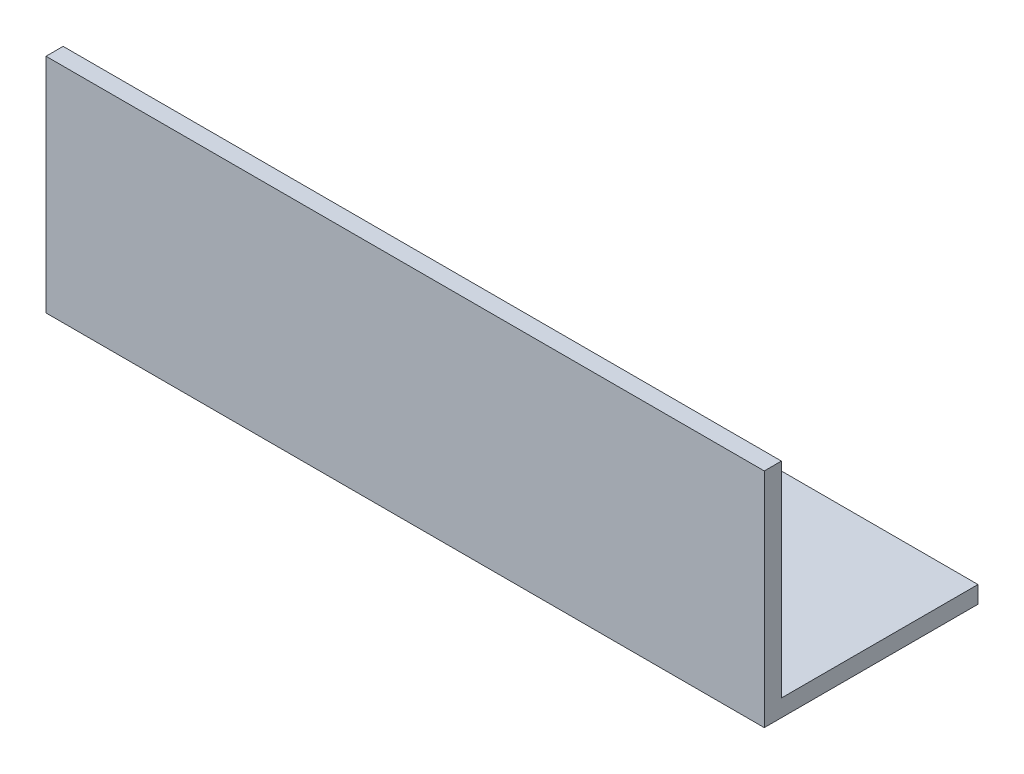
ISO-10303-21;
HEADER;
FILE_DESCRIPTION(('STEP AP214'),'2;1');
FILE_NAME('part.step','',(''),(''),'','','');
FILE_SCHEMA(('AUTOMOTIVE_DESIGN { 1 0 10303 214 1 1 1 1 }'));
ENDSEC;
DATA;
#1=APPLICATION_CONTEXT('core data for automotive mechanical design processes');
#2=APPLICATION_PROTOCOL_DEFINITION('international standard','automotive_design',2000,#1);
#3=PRODUCT_CONTEXT('',#1,'mechanical');
#4=PRODUCT('Part','Part','',(#3));
#5=PRODUCT_RELATED_PRODUCT_CATEGORY('part','',(#4));
#6=PRODUCT_DEFINITION_FORMATION('','',#4);
#7=PRODUCT_DEFINITION_CONTEXT('part definition',#1,'design');
#8=PRODUCT_DEFINITION('design','',#6,#7);
#9=PRODUCT_DEFINITION_SHAPE('','',#8);
#10=(LENGTH_UNIT() NAMED_UNIT(*) SI_UNIT(.MILLI.,.METRE.));
#11=(NAMED_UNIT(*) PLANE_ANGLE_UNIT() SI_UNIT($,.RADIAN.));
#12=(NAMED_UNIT(*) SI_UNIT($,.STERADIAN.) SOLID_ANGLE_UNIT());
#13=UNCERTAINTY_MEASURE_WITH_UNIT(LENGTH_MEASURE(1.E-05),#10,'distance_accuracy_value','');
#14=(GEOMETRIC_REPRESENTATION_CONTEXT(3) GLOBAL_UNCERTAINTY_ASSIGNED_CONTEXT((#13)) GLOBAL_UNIT_ASSIGNED_CONTEXT((#10,
#11,#12)) REPRESENTATION_CONTEXT('',''));
#15=CARTESIAN_POINT('',(0.,0.,0.));
#16=DIRECTION('',(0.,0.,1.));
#17=DIRECTION('',(1.,0.,0.));
#18=AXIS2_PLACEMENT_3D('',#15,#16,#17);
#19=CARTESIAN_POINT('',(0.,20.64,-0.800000000000001));
#20=DIRECTION('',(0.,0.,-1.));
#21=DIRECTION('',(-1.,0.,0.));
#22=AXIS2_PLACEMENT_3D('',#19,#20,#21);
#23=PLANE('',#22);
#24=DIRECTION('',(1.,0.,0.));
#25=VECTOR('',#24,1.);
#26=CARTESIAN_POINT('',(0.,1.59,-0.800000000000001));
#27=LINE('',#26,#25);
#28=CARTESIAN_POINT('',(-33.34,1.59,-0.800000000000002));
#29=VERTEX_POINT('',#28);
#30=CARTESIAN_POINT('',(33.34,1.59,-0.800000000000002));
#31=VERTEX_POINT('',#30);
#32=EDGE_CURVE('E201',#29,#31,#27,.T.);
#33=ORIENTED_EDGE('',*,*,#32,.F.);
#34=DIRECTION('',(0.,-1.,0.));
#35=VECTOR('',#34,1.);
#36=CARTESIAN_POINT('',(-33.34,20.64,-0.800000000000001));
#37=LINE('',#36,#35);
#38=CARTESIAN_POINT('',(-33.34,20.64,-0.800000000000001));
#39=VERTEX_POINT('',#38);
#40=EDGE_CURVE('E180',#39,#29,#37,.T.);
#41=ORIENTED_EDGE('',*,*,#40,.F.);
#42=DIRECTION('',(1.,0.,0.));
#43=VECTOR('',#42,1.);
#44=CARTESIAN_POINT('',(0.,20.64,-0.800000000000001));
#45=LINE('',#44,#43);
#46=CARTESIAN_POINT('',(33.34,20.64,-0.800000000000001));
#47=VERTEX_POINT('',#46);
#48=EDGE_CURVE('E12',#39,#47,#45,.T.);
#49=ORIENTED_EDGE('',*,*,#48,.T.);
#50=DIRECTION('',(0.,-1.,0.));
#51=VECTOR('',#50,1.);
#52=CARTESIAN_POINT('',(33.34,20.64,-0.800000000000001));
#53=LINE('',#52,#51);
#54=EDGE_CURVE('E178',#47,#31,#53,.T.);
#55=ORIENTED_EDGE('',*,*,#54,.T.);
#56=EDGE_LOOP('',(#33,#41,#49,#55));
#57=FACE_BOUND('',#56,.T.);
#58=ADVANCED_FACE('F143',(#57),#23,.T.);
#59=CARTESIAN_POINT('',(0.,20.64,0.));
#60=DIRECTION('',(0.,1.,0.));
#61=DIRECTION('',(0.,0.,1.));
#62=AXIS2_PLACEMENT_3D('',#59,#60,#61);
#63=PLANE('',#62);
#64=ORIENTED_EDGE('',*,*,#48,.F.);
#65=DIRECTION('',(0.,0.,-1.));
#66=VECTOR('',#65,1.);
#67=CARTESIAN_POINT('',(-33.34,20.64,0.79));
#68=LINE('',#67,#66);
#69=CARTESIAN_POINT('',(-33.34,20.64,0.79));
#70=VERTEX_POINT('',#69);
#71=EDGE_CURVE('E206',#70,#39,#68,.T.);
#72=ORIENTED_EDGE('',*,*,#71,.F.);
#73=DIRECTION('',(1.,0.,0.));
#74=VECTOR('',#73,1.);
#75=CARTESIAN_POINT('',(0.,20.64,0.789999999999999));
#76=LINE('',#75,#74);
#77=CARTESIAN_POINT('',(33.34,20.64,0.789999999999999));
#78=VERTEX_POINT('',#77);
#79=EDGE_CURVE('E154',#70,#78,#76,.T.);
#80=ORIENTED_EDGE('',*,*,#79,.T.);
#81=DIRECTION('',(0.,0.,-1.));
#82=VECTOR('',#81,1.);
#83=CARTESIAN_POINT('',(33.34,20.64,0.789999999999999));
#84=LINE('',#83,#82);
#85=EDGE_CURVE('E183',#78,#47,#84,.T.);
#86=ORIENTED_EDGE('',*,*,#85,.T.);
#87=EDGE_LOOP('',(#64,#72,#80,#86));
#88=FACE_BOUND('',#87,.T.);
#89=ADVANCED_FACE('F184',(#88),#63,.T.);
#90=CARTESIAN_POINT('',(0.,0.,0.));
#91=DIRECTION('',(0.,1.,0.));
#92=DIRECTION('',(0.,0.,1.));
#93=AXIS2_PLACEMENT_3D('',#90,#91,#92);
#94=PLANE('',#93);
#95=DIRECTION('',(1.,0.,0.));
#96=VECTOR('',#95,1.);
#97=CARTESIAN_POINT('',(0.,0.,0.789999999999999));
#98=LINE('',#97,#96);
#99=CARTESIAN_POINT('',(-33.34,0.,0.79));
#100=VERTEX_POINT('',#99);
#101=CARTESIAN_POINT('',(33.34,0.,0.789999999999999));
#102=VERTEX_POINT('',#101);
#103=EDGE_CURVE('E209',#100,#102,#98,.T.);
#104=ORIENTED_EDGE('',*,*,#103,.F.);
#105=DIRECTION('',(0.,0.,-1.));
#106=VECTOR('',#105,1.);
#107=CARTESIAN_POINT('',(-33.34,0.,0.79));
#108=LINE('',#107,#106);
#109=CARTESIAN_POINT('',(-33.34,0.,-19.05));
#110=VERTEX_POINT('',#109);
#111=EDGE_CURVE('E197',#100,#110,#108,.T.);
#112=ORIENTED_EDGE('',*,*,#111,.T.);
#113=DIRECTION('',(1.,0.,0.));
#114=VECTOR('',#113,1.);
#115=CARTESIAN_POINT('',(0.,0.,-19.05));
#116=LINE('',#115,#114);
#117=CARTESIAN_POINT('',(33.34,0.,-19.05));
#118=VERTEX_POINT('',#117);
#119=EDGE_CURVE('E235',#110,#118,#116,.T.);
#120=ORIENTED_EDGE('',*,*,#119,.T.);
#121=DIRECTION('',(0.,0.,-1.));
#122=VECTOR('',#121,1.);
#123=CARTESIAN_POINT('',(33.34,0.,0.789999999999999));
#124=LINE('',#123,#122);
#125=EDGE_CURVE('E189',#102,#118,#124,.T.);
#126=ORIENTED_EDGE('',*,*,#125,.F.);
#127=EDGE_LOOP('',(#104,#112,#120,#126));
#128=FACE_BOUND('',#127,.T.);
#129=CARTESIAN_POINT('',(13.825,0.,-10.08));
#130=DIRECTION('',(0.,1.,0.));
#131=DIRECTION('',(0.,0.,1.));
#132=AXIS2_PLACEMENT_3D('',#129,#130,#131);
#133=CIRCLE('',#132,3.175);
#134=CARTESIAN_POINT('',(13.825,0.,-13.255));
#135=VERTEX_POINT('',#134);
#136=EDGE_CURVE('E244',#135,#135,#133,.T.);
#137=ORIENTED_EDGE('',*,*,#136,.T.);
#138=EDGE_LOOP('',(#137));
#139=FACE_BOUND('',#138,.T.);
#140=CARTESIAN_POINT('',(-13.825,0.,-10.08));
#141=DIRECTION('',(0.,1.,0.));
#142=DIRECTION('',(0.,0.,1.));
#143=AXIS2_PLACEMENT_3D('',#140,#141,#142);
#144=CIRCLE('',#143,3.175);
#145=CARTESIAN_POINT('',(-13.825,0.,-13.255));
#146=VERTEX_POINT('',#145);
#147=EDGE_CURVE('E239',#146,#146,#144,.T.);
#148=ORIENTED_EDGE('',*,*,#147,.T.);
#149=EDGE_LOOP('',(#148));
#150=FACE_BOUND('',#149,.T.);
#151=ADVANCED_FACE('F285',(#128,#139,#150),#94,.F.);
#152=CARTESIAN_POINT('',(0.,20.64,0.789999999999999));
#153=DIRECTION('',(0.,0.,-1.));
#154=DIRECTION('',(-1.,0.,0.));
#155=AXIS2_PLACEMENT_3D('',#152,#153,#154);
#156=PLANE('',#155);
#157=DIRECTION('',(0.,-1.,0.));
#158=VECTOR('',#157,1.);
#159=CARTESIAN_POINT('',(-33.34,20.64,0.79));
#160=LINE('',#159,#158);
#161=EDGE_CURVE('E203',#70,#100,#160,.T.);
#162=ORIENTED_EDGE('',*,*,#161,.T.);
#163=ORIENTED_EDGE('',*,*,#103,.T.);
#164=DIRECTION('',(0.,-1.,0.));
#165=VECTOR('',#164,1.);
#166=CARTESIAN_POINT('',(33.34,20.64,0.789999999999999));
#167=LINE('',#166,#165);
#168=EDGE_CURVE('E147',#78,#102,#167,.T.);
#169=ORIENTED_EDGE('',*,*,#168,.F.);
#170=ORIENTED_EDGE('',*,*,#79,.F.);
#171=EDGE_LOOP('',(#162,#163,#169,#170));
#172=FACE_BOUND('',#171,.T.);
#173=ADVANCED_FACE('F283',(#172),#156,.F.);
#174=CARTESIAN_POINT('',(33.34,20.64,0.789999999999999));
#175=DIRECTION('',(-1.,0.,0.));
#176=DIRECTION('',(0.,0.,1.));
#177=AXIS2_PLACEMENT_3D('',#174,#175,#176);
#178=PLANE('',#177);
#179=ORIENTED_EDGE('',*,*,#168,.T.);
#180=ORIENTED_EDGE('',*,*,#125,.T.);
#181=DIRECTION('',(0.,-1.,0.));
#182=VECTOR('',#181,1.);
#183=CARTESIAN_POINT('',(33.34,1.59,-19.05));
#184=LINE('',#183,#182);
#185=CARTESIAN_POINT('',(33.34,1.59,-19.05));
#186=VERTEX_POINT('',#185);
#187=EDGE_CURVE('E224',#186,#118,#184,.T.);
#188=ORIENTED_EDGE('',*,*,#187,.F.);
#189=DIRECTION('',(0.,0.,1.));
#190=VECTOR('',#189,1.);
#191=CARTESIAN_POINT('',(33.34,1.59,-19.05));
#192=LINE('',#191,#190);
#193=EDGE_CURVE('E194',#186,#31,#192,.T.);
#194=ORIENTED_EDGE('',*,*,#193,.T.);
#195=ORIENTED_EDGE('',*,*,#54,.F.);
#196=ORIENTED_EDGE('',*,*,#85,.F.);
#197=EDGE_LOOP('',(#179,#180,#188,#194,#195,#196));
#198=FACE_BOUND('',#197,.T.);
#199=ADVANCED_FACE('F145',(#198),#178,.F.);
#200=CARTESIAN_POINT('',(-33.34,20.64,0.79));
#201=DIRECTION('',(-1.,0.,0.));
#202=DIRECTION('',(0.,0.,1.));
#203=AXIS2_PLACEMENT_3D('',#200,#201,#202);
#204=PLANE('',#203);
#205=ORIENTED_EDGE('',*,*,#40,.T.);
#206=DIRECTION('',(0.,0.,1.));
#207=VECTOR('',#206,1.);
#208=CARTESIAN_POINT('',(-33.34,1.59,-19.05));
#209=LINE('',#208,#207);
#210=CARTESIAN_POINT('',(-33.34,1.59,-19.05));
#211=VERTEX_POINT('',#210);
#212=EDGE_CURVE('E228',#211,#29,#209,.T.);
#213=ORIENTED_EDGE('',*,*,#212,.F.);
#214=DIRECTION('',(0.,-1.,0.));
#215=VECTOR('',#214,1.);
#216=CARTESIAN_POINT('',(-33.34,1.59,-19.05));
#217=LINE('',#216,#215);
#218=EDGE_CURVE('E231',#211,#110,#217,.T.);
#219=ORIENTED_EDGE('',*,*,#218,.T.);
#220=ORIENTED_EDGE('',*,*,#111,.F.);
#221=ORIENTED_EDGE('',*,*,#161,.F.);
#222=ORIENTED_EDGE('',*,*,#71,.T.);
#223=EDGE_LOOP('',(#205,#213,#219,#220,#221,#222));
#224=FACE_BOUND('',#223,.T.);
#225=ADVANCED_FACE('F278',(#224),#204,.T.);
#226=CARTESIAN_POINT('',(-13.825,1.59,-10.08));
#227=DIRECTION('',(0.,-1.,0.));
#228=DIRECTION('',(0.,0.,-1.));
#229=AXIS2_PLACEMENT_3D('',#226,#227,#228);
#230=CYLINDRICAL_SURFACE('',#229,3.175);
#231=CARTESIAN_POINT('',(-13.825,1.59,-10.08));
#232=DIRECTION('',(0.,1.,0.));
#233=DIRECTION('',(0.,0.,1.));
#234=AXIS2_PLACEMENT_3D('',#231,#232,#233);
#235=CIRCLE('',#234,3.175);
#236=CARTESIAN_POINT('',(-13.825,1.59,-13.255));
#237=VERTEX_POINT('',#236);
#238=EDGE_CURVE('E223',#237,#237,#235,.T.);
#239=CARTESIAN_POINT('',(-13.825,1.59,-13.255));
#240=CARTESIAN_POINT('',(-13.825,1.5734375,-13.255));
#241=CARTESIAN_POINT('',(-13.825,1.556875,-13.255));
#242=CARTESIAN_POINT('',(-13.825,1.52375,-13.255));
#243=CARTESIAN_POINT('',(-13.825,1.5071875,-13.255));
#244=CARTESIAN_POINT('',(-13.825,1.4740625,-13.255));
#245=CARTESIAN_POINT('',(-13.825,1.4575,-13.255));
#246=CARTESIAN_POINT('',(-13.825,1.424375,-13.255));
#247=CARTESIAN_POINT('',(-13.825,1.4078125,-13.255));
#248=CARTESIAN_POINT('',(-13.825,1.3746875,-13.255));
#249=CARTESIAN_POINT('',(-13.825,1.358125,-13.255));
#250=CARTESIAN_POINT('',(-13.825,1.325,-13.255));
#251=CARTESIAN_POINT('',(-13.825,1.3084375,-13.255));
#252=CARTESIAN_POINT('',(-13.825,1.2753125,-13.255));
#253=CARTESIAN_POINT('',(-13.825,1.25875,-13.255));
#254=CARTESIAN_POINT('',(-13.825,1.225625,-13.255));
#255=CARTESIAN_POINT('',(-13.825,1.2090625,-13.255));
#256=CARTESIAN_POINT('',(-13.825,1.1759375,-13.255));
#257=CARTESIAN_POINT('',(-13.825,1.159375,-13.255));
#258=CARTESIAN_POINT('',(-13.825,1.12625,-13.255));
#259=CARTESIAN_POINT('',(-13.825,1.1096875,-13.255));
#260=CARTESIAN_POINT('',(-13.825,1.0765625,-13.255));
#261=CARTESIAN_POINT('',(-13.825,1.06,-13.255));
#262=CARTESIAN_POINT('',(-13.825,1.026875,-13.255));
#263=CARTESIAN_POINT('',(-13.825,1.0103125,-13.255));
#264=CARTESIAN_POINT('',(-13.825,0.9771875,-13.255));
#265=CARTESIAN_POINT('',(-13.825,0.960625,-13.255));
#266=CARTESIAN_POINT('',(-13.825,0.9275,-13.255));
#267=CARTESIAN_POINT('',(-13.825,0.9109375,-13.255));
#268=CARTESIAN_POINT('',(-13.825,0.8778125,-13.255));
#269=CARTESIAN_POINT('',(-13.825,0.86125,-13.255));
#270=CARTESIAN_POINT('',(-13.825,0.828125,-13.255));
#271=CARTESIAN_POINT('',(-13.825,0.8115625,-13.255));
#272=CARTESIAN_POINT('',(-13.825,0.7784375,-13.255));
#273=CARTESIAN_POINT('',(-13.825,0.761875,-13.255));
#274=CARTESIAN_POINT('',(-13.825,0.72875,-13.255));
#275=CARTESIAN_POINT('',(-13.825,0.7121875,-13.255));
#276=CARTESIAN_POINT('',(-13.825,0.6790625,-13.255));
#277=CARTESIAN_POINT('',(-13.825,0.6625,-13.255));
#278=CARTESIAN_POINT('',(-13.825,0.629375,-13.255));
#279=CARTESIAN_POINT('',(-13.825,0.6128125,-13.255));
#280=CARTESIAN_POINT('',(-13.825,0.5796875,-13.255));
#281=CARTESIAN_POINT('',(-13.825,0.563125,-13.255));
#282=CARTESIAN_POINT('',(-13.825,0.53,-13.255));
#283=CARTESIAN_POINT('',(-13.825,0.5134375,-13.255));
#284=CARTESIAN_POINT('',(-13.825,0.4803125,-13.255));
#285=CARTESIAN_POINT('',(-13.825,0.46375,-13.255));
#286=CARTESIAN_POINT('',(-13.825,0.430625,-13.255));
#287=CARTESIAN_POINT('',(-13.825,0.4140625,-13.255));
#288=CARTESIAN_POINT('',(-13.825,0.3809375,-13.255));
#289=CARTESIAN_POINT('',(-13.825,0.364375,-13.255));
#290=CARTESIAN_POINT('',(-13.825,0.33125,-13.255));
#291=CARTESIAN_POINT('',(-13.825,0.3146875,-13.255));
#292=CARTESIAN_POINT('',(-13.825,0.2815625,-13.255));
#293=CARTESIAN_POINT('',(-13.825,0.265,-13.255));
#294=CARTESIAN_POINT('',(-13.825,0.231875,-13.255));
#295=CARTESIAN_POINT('',(-13.825,0.2153125,-13.255));
#296=CARTESIAN_POINT('',(-13.825,0.1821875,-13.255));
#297=CARTESIAN_POINT('',(-13.825,0.165625,-13.255));
#298=CARTESIAN_POINT('',(-13.825,0.1325,-13.255));
#299=CARTESIAN_POINT('',(-13.825,0.1159375,-13.255));
#300=CARTESIAN_POINT('',(-13.825,0.0828125000000001,-13.255));
#301=CARTESIAN_POINT('',(-13.825,0.06625,-13.255));
#302=CARTESIAN_POINT('',(-13.825,0.033125,-13.255));
#303=CARTESIAN_POINT('',(-13.825,0.0165625,-13.255));
#304=CARTESIAN_POINT('',(-13.825,0.,-13.255));
#305=B_SPLINE_CURVE_WITH_KNOTS('',3,(#239,#240,#241,#242,#243,#244,#245,#246,#247,#248,#249,
#250,#251,#252,#253,#254,#255,#256,#257,#258,#259,#260,#261,#262,#263,#264,#265,#266,#267,#268,
#269,#270,#271,#272,#273,#274,#275,#276,#277,#278,#279,#280,#281,#282,#283,#284,#285,#286,#287,
#288,#289,#290,#291,#292,#293,#294,#295,#296,#297,#298,#299,#300,#301,#302,#303,#304),
.UNSPECIFIED.,.F.,.F.,(4,2,2,2,2,2,2,2,2,2,2,2,2,2,2,2,2,2,2,2,2,2,2,2,2,2,2,2,2,2,2,2,4),(0.,
0.0496874999999998,0.0993749999999999,0.1490625,0.19875,0.2484375,0.298125,0.3478125,0.3975,
0.4471875,0.496875,0.5465625,0.59625,0.6459375,0.695625,0.7453125,0.795,0.8446875,0.894375,
0.9440625,0.99375,1.0434375,1.093125,1.1428125,1.1925,1.2421875,1.291875,1.3415625,1.39125,
1.4409375,1.490625,1.5403125,1.59),.UNSPECIFIED.);
#306=EDGE_CURVE('BSEAM296',#237,#146,#305,.T.);
#307=ORIENTED_EDGE('',*,*,#238,.T.);
#308=ORIENTED_EDGE('',*,*,#147,.F.);
#309=ORIENTED_EDGE('',*,*,#306,.T.);
#310=ORIENTED_EDGE('',*,*,#306,.F.);
#311=EDGE_LOOP('',(#307,#309,#308,#310));
#312=FACE_BOUND('',#311,.T.);
#313=ADVANCED_FACE('F296',(#312),#230,.F.);
#314=CARTESIAN_POINT('',(13.825,1.59,-10.08));
#315=DIRECTION('',(0.,-1.,0.));
#316=DIRECTION('',(0.,0.,-1.));
#317=AXIS2_PLACEMENT_3D('',#314,#315,#316);
#318=CYLINDRICAL_SURFACE('',#317,3.175);
#319=CARTESIAN_POINT('',(13.825,1.59,-10.08));
#320=DIRECTION('',(0.,1.,0.));
#321=DIRECTION('',(0.,0.,1.));
#322=AXIS2_PLACEMENT_3D('',#319,#320,#321);
#323=CIRCLE('',#322,3.175);
#324=CARTESIAN_POINT('',(13.825,1.59,-13.255));
#325=VERTEX_POINT('',#324);
#326=EDGE_CURVE('E254',#325,#325,#323,.T.);
#327=CARTESIAN_POINT('',(13.825,1.59,-13.255));
#328=CARTESIAN_POINT('',(13.825,1.5734375,-13.255));
#329=CARTESIAN_POINT('',(13.825,1.556875,-13.255));
#330=CARTESIAN_POINT('',(13.825,1.52375,-13.255));
#331=CARTESIAN_POINT('',(13.825,1.5071875,-13.255));
#332=CARTESIAN_POINT('',(13.825,1.4740625,-13.255));
#333=CARTESIAN_POINT('',(13.825,1.4575,-13.255));
#334=CARTESIAN_POINT('',(13.825,1.424375,-13.255));
#335=CARTESIAN_POINT('',(13.825,1.4078125,-13.255));
#336=CARTESIAN_POINT('',(13.825,1.3746875,-13.255));
#337=CARTESIAN_POINT('',(13.825,1.358125,-13.255));
#338=CARTESIAN_POINT('',(13.825,1.325,-13.255));
#339=CARTESIAN_POINT('',(13.825,1.3084375,-13.255));
#340=CARTESIAN_POINT('',(13.825,1.2753125,-13.255));
#341=CARTESIAN_POINT('',(13.825,1.25875,-13.255));
#342=CARTESIAN_POINT('',(13.825,1.225625,-13.255));
#343=CARTESIAN_POINT('',(13.825,1.2090625,-13.255));
#344=CARTESIAN_POINT('',(13.825,1.1759375,-13.255));
#345=CARTESIAN_POINT('',(13.825,1.159375,-13.255));
#346=CARTESIAN_POINT('',(13.825,1.12625,-13.255));
#347=CARTESIAN_POINT('',(13.825,1.1096875,-13.255));
#348=CARTESIAN_POINT('',(13.825,1.0765625,-13.255));
#349=CARTESIAN_POINT('',(13.825,1.06,-13.255));
#350=CARTESIAN_POINT('',(13.825,1.026875,-13.255));
#351=CARTESIAN_POINT('',(13.825,1.0103125,-13.255));
#352=CARTESIAN_POINT('',(13.825,0.9771875,-13.255));
#353=CARTESIAN_POINT('',(13.825,0.960625,-13.255));
#354=CARTESIAN_POINT('',(13.825,0.9275,-13.255));
#355=CARTESIAN_POINT('',(13.825,0.9109375,-13.255));
#356=CARTESIAN_POINT('',(13.825,0.8778125,-13.255));
#357=CARTESIAN_POINT('',(13.825,0.86125,-13.255));
#358=CARTESIAN_POINT('',(13.825,0.828125,-13.255));
#359=CARTESIAN_POINT('',(13.825,0.8115625,-13.255));
#360=CARTESIAN_POINT('',(13.825,0.7784375,-13.255));
#361=CARTESIAN_POINT('',(13.825,0.761875,-13.255));
#362=CARTESIAN_POINT('',(13.825,0.72875,-13.255));
#363=CARTESIAN_POINT('',(13.825,0.7121875,-13.255));
#364=CARTESIAN_POINT('',(13.825,0.6790625,-13.255));
#365=CARTESIAN_POINT('',(13.825,0.6625,-13.255));
#366=CARTESIAN_POINT('',(13.825,0.629375,-13.255));
#367=CARTESIAN_POINT('',(13.825,0.6128125,-13.255));
#368=CARTESIAN_POINT('',(13.825,0.5796875,-13.255));
#369=CARTESIAN_POINT('',(13.825,0.563125,-13.255));
#370=CARTESIAN_POINT('',(13.825,0.53,-13.255));
#371=CARTESIAN_POINT('',(13.825,0.5134375,-13.255));
#372=CARTESIAN_POINT('',(13.825,0.4803125,-13.255));
#373=CARTESIAN_POINT('',(13.825,0.46375,-13.255));
#374=CARTESIAN_POINT('',(13.825,0.430625,-13.255));
#375=CARTESIAN_POINT('',(13.825,0.4140625,-13.255));
#376=CARTESIAN_POINT('',(13.825,0.3809375,-13.255));
#377=CARTESIAN_POINT('',(13.825,0.364375,-13.255));
#378=CARTESIAN_POINT('',(13.825,0.33125,-13.255));
#379=CARTESIAN_POINT('',(13.825,0.3146875,-13.255));
#380=CARTESIAN_POINT('',(13.825,0.2815625,-13.255));
#381=CARTESIAN_POINT('',(13.825,0.265,-13.255));
#382=CARTESIAN_POINT('',(13.825,0.231875,-13.255));
#383=CARTESIAN_POINT('',(13.825,0.2153125,-13.255));
#384=CARTESIAN_POINT('',(13.825,0.1821875,-13.255));
#385=CARTESIAN_POINT('',(13.825,0.165625,-13.255));
#386=CARTESIAN_POINT('',(13.825,0.1325,-13.255));
#387=CARTESIAN_POINT('',(13.825,0.1159375,-13.255));
#388=CARTESIAN_POINT('',(13.825,0.0828125000000001,-13.255));
#389=CARTESIAN_POINT('',(13.825,0.06625,-13.255));
#390=CARTESIAN_POINT('',(13.825,0.033125,-13.255));
#391=CARTESIAN_POINT('',(13.825,0.0165625,-13.255));
#392=CARTESIAN_POINT('',(13.825,0.,-13.255));
#393=B_SPLINE_CURVE_WITH_KNOTS('',3,(#327,#328,#329,#330,#331,#332,#333,#334,#335,#336,#337,
#338,#339,#340,#341,#342,#343,#344,#345,#346,#347,#348,#349,#350,#351,#352,#353,#354,#355,#356,
#357,#358,#359,#360,#361,#362,#363,#364,#365,#366,#367,#368,#369,#370,#371,#372,#373,#374,#375,
#376,#377,#378,#379,#380,#381,#382,#383,#384,#385,#386,#387,#388,#389,#390,#391,#392),
.UNSPECIFIED.,.F.,.F.,(4,2,2,2,2,2,2,2,2,2,2,2,2,2,2,2,2,2,2,2,2,2,2,2,2,2,2,2,2,2,2,2,4),(0.,
0.0496874999999998,0.0993749999999999,0.1490625,0.19875,0.2484375,0.298125,0.3478125,0.3975,
0.4471875,0.496875,0.5465625,0.59625,0.6459375,0.695625,0.7453125,0.795,0.8446875,0.894375,
0.9440625,0.99375,1.0434375,1.093125,1.1428125,1.1925,1.2421875,1.291875,1.3415625,1.39125,
1.4409375,1.490625,1.5403125,1.59),.UNSPECIFIED.);
#394=EDGE_CURVE('BSEAM298',#325,#135,#393,.T.);
#395=ORIENTED_EDGE('',*,*,#326,.T.);
#396=ORIENTED_EDGE('',*,*,#136,.F.);
#397=ORIENTED_EDGE('',*,*,#394,.T.);
#398=ORIENTED_EDGE('',*,*,#394,.F.);
#399=EDGE_LOOP('',(#395,#397,#396,#398));
#400=FACE_BOUND('',#399,.T.);
#401=ADVANCED_FACE('F298',(#400),#318,.F.);
#402=CARTESIAN_POINT('',(0.,1.59,-19.05));
#403=DIRECTION('',(0.,0.,-1.));
#404=DIRECTION('',(-1.,0.,0.));
#405=AXIS2_PLACEMENT_3D('',#402,#403,#404);
#406=PLANE('',#405);
#407=ORIENTED_EDGE('',*,*,#119,.F.);
#408=ORIENTED_EDGE('',*,*,#218,.F.);
#409=DIRECTION('',(1.,0.,0.));
#410=VECTOR('',#409,1.);
#411=CARTESIAN_POINT('',(0.,1.59,-19.05));
#412=LINE('',#411,#410);
#413=EDGE_CURVE('E243',#211,#186,#412,.T.);
#414=ORIENTED_EDGE('',*,*,#413,.T.);
#415=ORIENTED_EDGE('',*,*,#187,.T.);
#416=EDGE_LOOP('',(#407,#408,#414,#415));
#417=FACE_BOUND('',#416,.T.);
#418=ADVANCED_FACE('F265',(#417),#406,.T.);
#419=CARTESIAN_POINT('',(0.,1.59,0.));
#420=DIRECTION('',(0.,1.,0.));
#421=DIRECTION('',(0.,0.,1.));
#422=AXIS2_PLACEMENT_3D('',#419,#420,#421);
#423=PLANE('',#422);
#424=ORIENTED_EDGE('',*,*,#212,.T.);
#425=ORIENTED_EDGE('',*,*,#32,.T.);
#426=ORIENTED_EDGE('',*,*,#193,.F.);
#427=ORIENTED_EDGE('',*,*,#413,.F.);
#428=EDGE_LOOP('',(#424,#425,#426,#427));
#429=FACE_BOUND('',#428,.T.);
#430=ORIENTED_EDGE('',*,*,#326,.F.);
#431=EDGE_LOOP('',(#430));
#432=FACE_BOUND('',#431,.T.);
#433=ORIENTED_EDGE('',*,*,#238,.F.);
#434=EDGE_LOOP('',(#433));
#435=FACE_BOUND('',#434,.T.);
#436=ADVANCED_FACE('F273',(#429,#432,#435),#423,.T.);
#437=CLOSED_SHELL('',(#58,#89,#151,#173,#199,#225,#313,#401,#418,#436));
#438=MANIFOLD_SOLID_BREP('B2',#437);
#439=ADVANCED_BREP_SHAPE_REPRESENTATION('',(#18,#438),#14);
#440=SHAPE_DEFINITION_REPRESENTATION(#9,#439);
ENDSEC;
END-ISO-10303-21;
